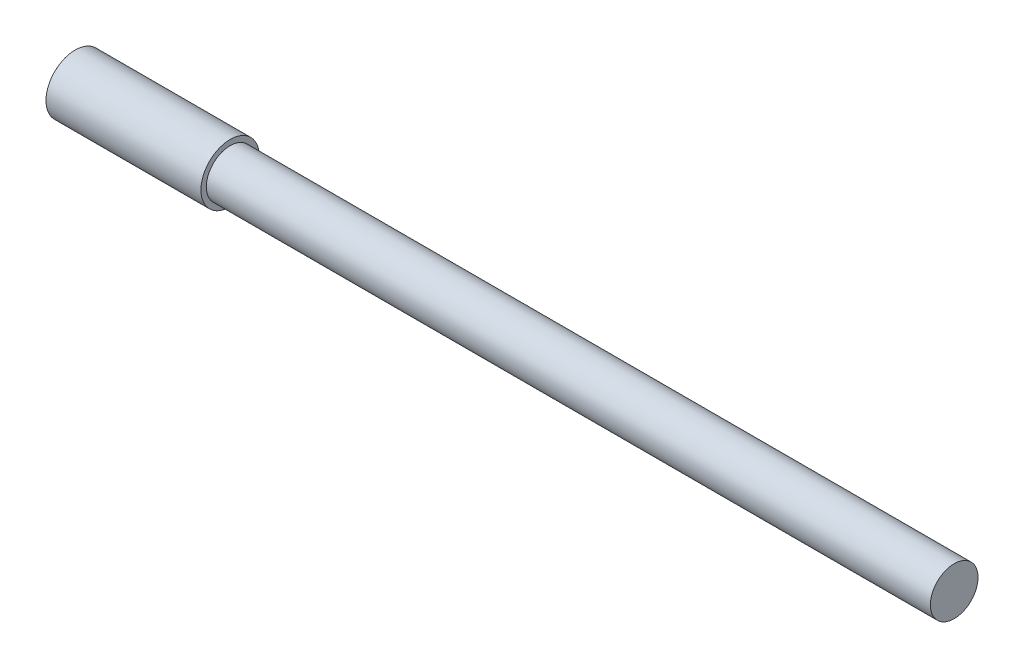
ISO-10303-21;
HEADER;
FILE_DESCRIPTION(('STEP AP214'),'2;1');
FILE_NAME('part.step','',(''),(''),'','','');
FILE_SCHEMA(('AUTOMOTIVE_DESIGN { 1 0 10303 214 1 1 1 1 }'));
ENDSEC;
DATA;
#1=APPLICATION_CONTEXT('core data for automotive mechanical design processes');
#2=APPLICATION_PROTOCOL_DEFINITION('international standard','automotive_design',2000,#1);
#3=PRODUCT_CONTEXT('',#1,'mechanical');
#4=PRODUCT('Part','Part','',(#3));
#5=PRODUCT_RELATED_PRODUCT_CATEGORY('part','',(#4));
#6=PRODUCT_DEFINITION_FORMATION('','',#4);
#7=PRODUCT_DEFINITION_CONTEXT('part definition',#1,'design');
#8=PRODUCT_DEFINITION('design','',#6,#7);
#9=PRODUCT_DEFINITION_SHAPE('','',#8);
#10=(LENGTH_UNIT() NAMED_UNIT(*) SI_UNIT(.MILLI.,.METRE.));
#11=(NAMED_UNIT(*) PLANE_ANGLE_UNIT() SI_UNIT($,.RADIAN.));
#12=(NAMED_UNIT(*) SI_UNIT($,.STERADIAN.) SOLID_ANGLE_UNIT());
#13=UNCERTAINTY_MEASURE_WITH_UNIT(LENGTH_MEASURE(1.E-05),#10,'distance_accuracy_value','');
#14=(GEOMETRIC_REPRESENTATION_CONTEXT(3) GLOBAL_UNCERTAINTY_ASSIGNED_CONTEXT((#13)) GLOBAL_UNIT_ASSIGNED_CONTEXT((#10,
#11,#12)) REPRESENTATION_CONTEXT('',''));
#15=CARTESIAN_POINT('',(0.,0.,0.));
#16=DIRECTION('',(0.,0.,1.));
#17=DIRECTION('',(1.,0.,0.));
#18=AXIS2_PLACEMENT_3D('',#15,#16,#17);
#19=CARTESIAN_POINT('',(0.,0.,0.));
#20=DIRECTION('',(-1.,0.,0.));
#21=DIRECTION('',(0.,0.,1.));
#22=AXIS2_PLACEMENT_3D('',#19,#20,#21);
#23=PLANE('',#22);
#24=CARTESIAN_POINT('',(0.,0.,-4.9));
#25=DIRECTION('',(-1.,0.,0.));
#26=DIRECTION('',(0.,0.,1.));
#27=AXIS2_PLACEMENT_3D('',#24,#25,#26);
#28=CIRCLE('',#27,4.9);
#29=CARTESIAN_POINT('',(0.,0.,0.));
#30=VERTEX_POINT('',#29);
#31=EDGE_CURVE('E10',#30,#30,#28,.T.);
#32=ORIENTED_EDGE('',*,*,#31,.T.);
#33=EDGE_LOOP('',(#32));
#34=FACE_BOUND('',#33,.T.);
#35=ADVANCED_FACE('F37',(#34),#23,.T.);
#36=CARTESIAN_POINT('',(0.,0.,-4.9));
#37=DIRECTION('',(-1.,0.,0.));
#38=DIRECTION('',(0.,0.,1.));
#39=AXIS2_PLACEMENT_3D('',#36,#37,#38);
#40=CYLINDRICAL_SURFACE('',#39,4.9);
#41=CARTESIAN_POINT('',(26.,0.,-4.9));
#42=DIRECTION('',(-1.,0.,0.));
#43=DIRECTION('',(0.,0.,1.));
#44=AXIS2_PLACEMENT_3D('',#41,#42,#43);
#45=CIRCLE('',#44,4.9);
#46=CARTESIAN_POINT('',(26.,0.,0.));
#47=VERTEX_POINT('',#46);
#48=EDGE_CURVE('E44',#47,#47,#45,.T.);
#49=ORIENTED_EDGE('',*,*,#48,.T.);
#50=EDGE_LOOP('',(#49));
#51=FACE_BOUND('',#50,.T.);
#52=ORIENTED_EDGE('',*,*,#31,.F.);
#53=EDGE_LOOP('',(#52));
#54=FACE_BOUND('',#53,.T.);
#55=ADVANCED_FACE('F73',(#51,#54),#40,.T.);
#56=CARTESIAN_POINT('',(26.,0.,0.));
#57=DIRECTION('',(1.,0.,0.));
#58=DIRECTION('',(0.,0.,-1.));
#59=AXIS2_PLACEMENT_3D('',#56,#57,#58);
#60=PLANE('',#59);
#61=CARTESIAN_POINT('',(26.,0.,-4.9));
#62=DIRECTION('',(-1.,0.,0.));
#63=DIRECTION('',(0.,0.,1.));
#64=AXIS2_PLACEMENT_3D('',#61,#62,#63);
#65=CIRCLE('',#64,3.99999999999998);
#66=CARTESIAN_POINT('',(26.,0.,-0.900000000000021));
#67=VERTEX_POINT('',#66);
#68=EDGE_CURVE('E49',#67,#67,#65,.T.);
#69=ORIENTED_EDGE('',*,*,#68,.T.);
#70=EDGE_LOOP('',(#69));
#71=FACE_BOUND('',#70,.T.);
#72=ORIENTED_EDGE('',*,*,#48,.F.);
#73=EDGE_LOOP('',(#72));
#74=FACE_BOUND('',#73,.T.);
#75=ADVANCED_FACE('F70',(#71,#74),#60,.T.);
#76=CARTESIAN_POINT('',(0.,0.,-4.9));
#77=DIRECTION('',(-1.,0.,0.));
#78=DIRECTION('',(0.,0.,1.));
#79=AXIS2_PLACEMENT_3D('',#76,#77,#78);
#80=CYLINDRICAL_SURFACE('',#79,3.99999999999998);
#81=CARTESIAN_POINT('',(147.5,0.,-4.9));
#82=DIRECTION('',(-1.,0.,0.));
#83=DIRECTION('',(0.,0.,1.));
#84=AXIS2_PLACEMENT_3D('',#81,#82,#83);
#85=CIRCLE('',#84,3.99999999999998);
#86=CARTESIAN_POINT('',(147.5,0.,-0.900000000000021));
#87=VERTEX_POINT('',#86);
#88=EDGE_CURVE('E54',#87,#87,#85,.T.);
#89=ORIENTED_EDGE('',*,*,#88,.T.);
#90=EDGE_LOOP('',(#89));
#91=FACE_BOUND('',#90,.T.);
#92=ORIENTED_EDGE('',*,*,#68,.F.);
#93=EDGE_LOOP('',(#92));
#94=FACE_BOUND('',#93,.T.);
#95=ADVANCED_FACE('F61',(#91,#94),#80,.T.);
#96=CARTESIAN_POINT('',(147.5,0.,-0.900000000000021));
#97=DIRECTION('',(1.,0.,0.));
#98=DIRECTION('',(0.,0.,-1.));
#99=AXIS2_PLACEMENT_3D('',#96,#97,#98);
#100=PLANE('',#99);
#101=ORIENTED_EDGE('',*,*,#88,.F.);
#102=EDGE_LOOP('',(#101));
#103=FACE_BOUND('',#102,.T.);
#104=ADVANCED_FACE('F64',(#103),#100,.T.);
#105=CLOSED_SHELL('',(#35,#55,#75,#95,#104));
#106=MANIFOLD_SOLID_BREP('B2',#105);
#107=ADVANCED_BREP_SHAPE_REPRESENTATION('',(#18,#106),#14);
#108=SHAPE_DEFINITION_REPRESENTATION(#9,#107);
ENDSEC;
END-ISO-10303-21;
